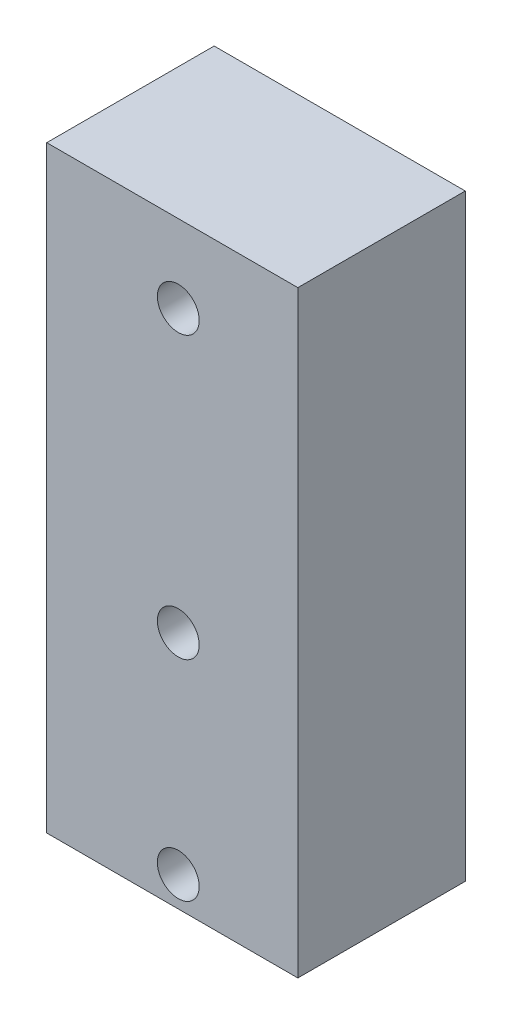
ISO-10303-21;
HEADER;
FILE_DESCRIPTION(('STEP AP214'),'2;1');
FILE_NAME('part.step','',(''),(''),'','','');
FILE_SCHEMA(('AUTOMOTIVE_DESIGN { 1 0 10303 214 1 1 1 1 }'));
ENDSEC;
DATA;
#1=APPLICATION_CONTEXT('core data for automotive mechanical design processes');
#2=APPLICATION_PROTOCOL_DEFINITION('international standard','automotive_design',2000,#1);
#3=PRODUCT_CONTEXT('',#1,'mechanical');
#4=PRODUCT('Part','Part','',(#3));
#5=PRODUCT_RELATED_PRODUCT_CATEGORY('part','',(#4));
#6=PRODUCT_DEFINITION_FORMATION('','',#4);
#7=PRODUCT_DEFINITION_CONTEXT('part definition',#1,'design');
#8=PRODUCT_DEFINITION('design','',#6,#7);
#9=PRODUCT_DEFINITION_SHAPE('','',#8);
#10=(LENGTH_UNIT() NAMED_UNIT(*) SI_UNIT(.MILLI.,.METRE.));
#11=(NAMED_UNIT(*) PLANE_ANGLE_UNIT() SI_UNIT($,.RADIAN.));
#12=(NAMED_UNIT(*) SI_UNIT($,.STERADIAN.) SOLID_ANGLE_UNIT());
#13=UNCERTAINTY_MEASURE_WITH_UNIT(LENGTH_MEASURE(1.E-05),#10,'distance_accuracy_value','');
#14=(GEOMETRIC_REPRESENTATION_CONTEXT(3) GLOBAL_UNCERTAINTY_ASSIGNED_CONTEXT((#13)) GLOBAL_UNIT_ASSIGNED_CONTEXT((#10,
#11,#12)) REPRESENTATION_CONTEXT('',''));
#15=CARTESIAN_POINT('',(0.,0.,0.));
#16=DIRECTION('',(0.,0.,1.));
#17=DIRECTION('',(1.,0.,0.));
#18=AXIS2_PLACEMENT_3D('',#15,#16,#17);
#19=CARTESIAN_POINT('',(10.,50.,2.95454545454545));
#20=DIRECTION('',(-1.,0.,0.));
#21=DIRECTION('',(0.,0.,1.));
#22=AXIS2_PLACEMENT_3D('',#19,#20,#21);
#23=PLANE('',#22);
#24=DIRECTION('',(0.,0.,-1.));
#25=VECTOR('',#24,1.);
#26=CARTESIAN_POINT('',(10.,0.,2.95454545454545));
#27=LINE('',#26,#25);
#28=CARTESIAN_POINT('',(10.,0.,2.95454545454545));
#29=VERTEX_POINT('',#28);
#30=CARTESIAN_POINT('',(10.,0.,-11.0454545454545));
#31=VERTEX_POINT('',#30);
#32=EDGE_CURVE('E98',#29,#31,#27,.T.);
#33=ORIENTED_EDGE('',*,*,#32,.T.);
#34=DIRECTION('',(0.,-1.,0.));
#35=VECTOR('',#34,1.);
#36=CARTESIAN_POINT('',(10.,50.,-11.0454545454545));
#37=LINE('',#36,#35);
#38=CARTESIAN_POINT('',(10.,50.,-11.0454545454545));
#39=VERTEX_POINT('',#38);
#40=EDGE_CURVE('E11',#39,#31,#37,.T.);
#41=ORIENTED_EDGE('',*,*,#40,.F.);
#42=DIRECTION('',(0.,0.,-1.));
#43=VECTOR('',#42,1.);
#44=CARTESIAN_POINT('',(10.,50.,2.95454545454545));
#45=LINE('',#44,#43);
#46=CARTESIAN_POINT('',(10.,50.,2.95454545454545));
#47=VERTEX_POINT('',#46);
#48=EDGE_CURVE('E85',#47,#39,#45,.T.);
#49=ORIENTED_EDGE('',*,*,#48,.F.);
#50=DIRECTION('',(0.,-1.,0.));
#51=VECTOR('',#50,1.);
#52=CARTESIAN_POINT('',(10.,50.,2.95454545454545));
#53=LINE('',#52,#51);
#54=EDGE_CURVE('E94',#47,#29,#53,.T.);
#55=ORIENTED_EDGE('',*,*,#54,.T.);
#56=EDGE_LOOP('',(#33,#41,#49,#55));
#57=FACE_BOUND('',#56,.T.);
#58=ADVANCED_FACE('F33',(#57),#23,.F.);
#59=CARTESIAN_POINT('',(-11.,50.,-11.0454545454545));
#60=DIRECTION('',(0.,0.,1.));
#61=DIRECTION('',(1.,0.,0.));
#62=AXIS2_PLACEMENT_3D('',#59,#60,#61);
#63=PLANE('',#62);
#64=CARTESIAN_POINT('',(0.,43.5,-11.0454545454545));
#65=DIRECTION('',(0.,0.,-1.));
#66=DIRECTION('',(-1.,0.,0.));
#67=AXIS2_PLACEMENT_3D('',#64,#65,#66);
#68=CIRCLE('',#67,1.75);
#69=CARTESIAN_POINT('',(-1.75,43.5,-11.0454545454545));
#70=VERTEX_POINT('',#69);
#71=EDGE_CURVE('E123',#70,#70,#68,.T.);
#72=ORIENTED_EDGE('',*,*,#71,.F.);
#73=EDGE_LOOP('',(#72));
#74=FACE_BOUND('',#73,.T.);
#75=CARTESIAN_POINT('',(0.,20.,-11.0454545454546));
#76=DIRECTION('',(0.,0.,1.));
#77=DIRECTION('',(1.,0.,0.));
#78=AXIS2_PLACEMENT_3D('',#75,#76,#77);
#79=CIRCLE('',#78,1.75);
#80=CARTESIAN_POINT('',(1.75,20.,-11.0454545454546));
#81=VERTEX_POINT('',#80);
#82=EDGE_CURVE('E101',#81,#81,#79,.T.);
#83=ORIENTED_EDGE('',*,*,#82,.T.);
#84=EDGE_LOOP('',(#83));
#85=FACE_BOUND('',#84,.T.);
#86=CARTESIAN_POINT('',(0.,2.5,-11.0454545454546));
#87=DIRECTION('',(0.,0.,1.));
#88=DIRECTION('',(1.,0.,0.));
#89=AXIS2_PLACEMENT_3D('',#86,#87,#88);
#90=CIRCLE('',#89,1.75);
#91=CARTESIAN_POINT('',(1.75,2.5,-11.0454545454546));
#92=VERTEX_POINT('',#91);
#93=EDGE_CURVE('E114',#92,#92,#90,.T.);
#94=ORIENTED_EDGE('',*,*,#93,.T.);
#95=EDGE_LOOP('',(#94));
#96=FACE_BOUND('',#95,.T.);
#97=DIRECTION('',(-1.,0.,0.));
#98=VECTOR('',#97,1.);
#99=CARTESIAN_POINT('',(-11.,0.,-11.0454545454545));
#100=LINE('',#99,#98);
#101=CARTESIAN_POINT('',(-11.,0.,-11.0454545454545));
#102=VERTEX_POINT('',#101);
#103=EDGE_CURVE('E89',#31,#102,#100,.T.);
#104=ORIENTED_EDGE('',*,*,#103,.T.);
#105=DIRECTION('',(0.,-1.,0.));
#106=VECTOR('',#105,1.);
#107=CARTESIAN_POINT('',(-11.,50.,-11.0454545454545));
#108=LINE('',#107,#106);
#109=CARTESIAN_POINT('',(-11.,50.,-11.0454545454545));
#110=VERTEX_POINT('',#109);
#111=EDGE_CURVE('E42',#110,#102,#108,.T.);
#112=ORIENTED_EDGE('',*,*,#111,.F.);
#113=DIRECTION('',(-1.,0.,0.));
#114=VECTOR('',#113,1.);
#115=CARTESIAN_POINT('',(-11.,50.,-11.0454545454545));
#116=LINE('',#115,#114);
#117=EDGE_CURVE('E80',#39,#110,#116,.T.);
#118=ORIENTED_EDGE('',*,*,#117,.F.);
#119=ORIENTED_EDGE('',*,*,#40,.T.);
#120=EDGE_LOOP('',(#104,#112,#118,#119));
#121=FACE_BOUND('',#120,.T.);
#122=ADVANCED_FACE('F88',(#74,#85,#96,#121),#63,.F.);
#123=CARTESIAN_POINT('',(-11.,50.,-11.0454545454545));
#124=DIRECTION('',(1.,0.,0.));
#125=DIRECTION('',(0.,0.,-1.));
#126=AXIS2_PLACEMENT_3D('',#123,#124,#125);
#127=PLANE('',#126);
#128=DIRECTION('',(0.,0.,1.));
#129=VECTOR('',#128,1.);
#130=CARTESIAN_POINT('',(-11.,0.,-11.0454545454545));
#131=LINE('',#130,#129);
#132=CARTESIAN_POINT('',(-11.,0.,2.95454545454546));
#133=VERTEX_POINT('',#132);
#134=EDGE_CURVE('E67',#102,#133,#131,.T.);
#135=ORIENTED_EDGE('',*,*,#134,.T.);
#136=DIRECTION('',(0.,-1.,0.));
#137=VECTOR('',#136,1.);
#138=CARTESIAN_POINT('',(-11.,50.,2.95454545454546));
#139=LINE('',#138,#137);
#140=CARTESIAN_POINT('',(-11.,50.,2.95454545454546));
#141=VERTEX_POINT('',#140);
#142=EDGE_CURVE('E90',#141,#133,#139,.T.);
#143=ORIENTED_EDGE('',*,*,#142,.F.);
#144=DIRECTION('',(0.,0.,1.));
#145=VECTOR('',#144,1.);
#146=CARTESIAN_POINT('',(-11.,50.,-11.0454545454545));
#147=LINE('',#146,#145);
#148=EDGE_CURVE('E83',#110,#141,#147,.T.);
#149=ORIENTED_EDGE('',*,*,#148,.F.);
#150=ORIENTED_EDGE('',*,*,#111,.T.);
#151=EDGE_LOOP('',(#135,#143,#149,#150));
#152=FACE_BOUND('',#151,.T.);
#153=ADVANCED_FACE('F92',(#152),#127,.F.);
#154=CARTESIAN_POINT('',(-11.,50.,2.95454545454546));
#155=DIRECTION('',(0.,0.,-1.));
#156=DIRECTION('',(-1.,0.,0.));
#157=AXIS2_PLACEMENT_3D('',#154,#155,#156);
#158=PLANE('',#157);
#159=CARTESIAN_POINT('',(0.,43.5,2.95454545454546));
#160=DIRECTION('',(0.,0.,-1.));
#161=DIRECTION('',(-1.,0.,0.));
#162=AXIS2_PLACEMENT_3D('',#159,#160,#161);
#163=CIRCLE('',#162,1.75);
#164=CARTESIAN_POINT('',(-1.75,43.5,2.95454545454546));
#165=VERTEX_POINT('',#164);
#166=EDGE_CURVE('E36',#165,#165,#163,.T.);
#167=ORIENTED_EDGE('',*,*,#166,.T.);
#168=EDGE_LOOP('',(#167));
#169=FACE_BOUND('',#168,.T.);
#170=CARTESIAN_POINT('',(0.,20.,2.95454545454546));
#171=DIRECTION('',(0.,0.,1.));
#172=DIRECTION('',(1.,0.,0.));
#173=AXIS2_PLACEMENT_3D('',#170,#171,#172);
#174=CIRCLE('',#173,1.75);
#175=CARTESIAN_POINT('',(1.75,20.,2.95454545454546));
#176=VERTEX_POINT('',#175);
#177=EDGE_CURVE('E117',#176,#176,#174,.T.);
#178=ORIENTED_EDGE('',*,*,#177,.F.);
#179=EDGE_LOOP('',(#178));
#180=FACE_BOUND('',#179,.T.);
#181=CARTESIAN_POINT('',(0.,2.5,2.95454545454546));
#182=DIRECTION('',(0.,0.,1.));
#183=DIRECTION('',(1.,0.,0.));
#184=AXIS2_PLACEMENT_3D('',#181,#182,#183);
#185=CIRCLE('',#184,1.75);
#186=CARTESIAN_POINT('',(1.75,2.5,2.95454545454546));
#187=VERTEX_POINT('',#186);
#188=EDGE_CURVE('E118',#187,#187,#185,.T.);
#189=ORIENTED_EDGE('',*,*,#188,.F.);
#190=EDGE_LOOP('',(#189));
#191=FACE_BOUND('',#190,.T.);
#192=DIRECTION('',(1.,0.,0.));
#193=VECTOR('',#192,1.);
#194=CARTESIAN_POINT('',(-11.,0.,2.95454545454546));
#195=LINE('',#194,#193);
#196=EDGE_CURVE('E73',#133,#29,#195,.T.);
#197=ORIENTED_EDGE('',*,*,#196,.T.);
#198=ORIENTED_EDGE('',*,*,#54,.F.);
#199=DIRECTION('',(1.,0.,0.));
#200=VECTOR('',#199,1.);
#201=CARTESIAN_POINT('',(-11.,50.,2.95454545454546));
#202=LINE('',#201,#200);
#203=EDGE_CURVE('E50',#141,#47,#202,.T.);
#204=ORIENTED_EDGE('',*,*,#203,.F.);
#205=ORIENTED_EDGE('',*,*,#142,.T.);
#206=EDGE_LOOP('',(#197,#198,#204,#205));
#207=FACE_BOUND('',#206,.T.);
#208=ADVANCED_FACE('F106',(#169,#180,#191,#207),#158,.F.);
#209=CARTESIAN_POINT('',(0.,50.,0.));
#210=DIRECTION('',(0.,-1.,0.));
#211=DIRECTION('',(0.,0.,-1.));
#212=AXIS2_PLACEMENT_3D('',#209,#210,#211);
#213=PLANE('',#212);
#214=ORIENTED_EDGE('',*,*,#48,.T.);
#215=ORIENTED_EDGE('',*,*,#117,.T.);
#216=ORIENTED_EDGE('',*,*,#148,.T.);
#217=ORIENTED_EDGE('',*,*,#203,.T.);
#218=EDGE_LOOP('',(#214,#215,#216,#217));
#219=FACE_BOUND('',#218,.T.);
#220=ADVANCED_FACE('F81',(#219),#213,.F.);
#221=CARTESIAN_POINT('',(0.,0.,0.));
#222=DIRECTION('',(0.,-1.,0.));
#223=DIRECTION('',(0.,0.,-1.));
#224=AXIS2_PLACEMENT_3D('',#221,#222,#223);
#225=PLANE('',#224);
#226=ORIENTED_EDGE('',*,*,#32,.F.);
#227=ORIENTED_EDGE('',*,*,#196,.F.);
#228=ORIENTED_EDGE('',*,*,#134,.F.);
#229=ORIENTED_EDGE('',*,*,#103,.F.);
#230=EDGE_LOOP('',(#226,#227,#228,#229));
#231=FACE_BOUND('',#230,.T.);
#232=ADVANCED_FACE('F109',(#231),#225,.T.);
#233=CARTESIAN_POINT('',(0.,2.5,-97.0454545454545));
#234=DIRECTION('',(0.,0.,1.));
#235=DIRECTION('',(1.,0.,0.));
#236=AXIS2_PLACEMENT_3D('',#233,#234,#235);
#237=CYLINDRICAL_SURFACE('',#236,1.75);
#238=ORIENTED_EDGE('',*,*,#188,.T.);
#239=EDGE_LOOP('',(#238));
#240=FACE_BOUND('',#239,.T.);
#241=ORIENTED_EDGE('',*,*,#93,.F.);
#242=EDGE_LOOP('',(#241));
#243=FACE_BOUND('',#242,.T.);
#244=ADVANCED_FACE('F139',(#240,#243),#237,.F.);
#245=CARTESIAN_POINT('',(0.,20.,-97.0454545454545));
#246=DIRECTION('',(0.,0.,1.));
#247=DIRECTION('',(1.,0.,0.));
#248=AXIS2_PLACEMENT_3D('',#245,#246,#247);
#249=CYLINDRICAL_SURFACE('',#248,1.75);
#250=ORIENTED_EDGE('',*,*,#177,.T.);
#251=EDGE_LOOP('',(#250));
#252=FACE_BOUND('',#251,.T.);
#253=ORIENTED_EDGE('',*,*,#82,.F.);
#254=EDGE_LOOP('',(#253));
#255=FACE_BOUND('',#254,.T.);
#256=ADVANCED_FACE('F134',(#252,#255),#249,.F.);
#257=CARTESIAN_POINT('',(0.,43.5,10.9545454545455));
#258=DIRECTION('',(0.,0.,-1.));
#259=DIRECTION('',(-1.,0.,0.));
#260=AXIS2_PLACEMENT_3D('',#257,#258,#259);
#261=CYLINDRICAL_SURFACE('',#260,1.75);
#262=ORIENTED_EDGE('',*,*,#71,.T.);
#263=EDGE_LOOP('',(#262));
#264=FACE_BOUND('',#263,.T.);
#265=ORIENTED_EDGE('',*,*,#166,.F.);
#266=EDGE_LOOP('',(#265));
#267=FACE_BOUND('',#266,.T.);
#268=ADVANCED_FACE('F132',(#264,#267),#261,.F.);
#269=CLOSED_SHELL('',(#58,#122,#153,#208,#220,#232,#244,#256,#268));
#270=MANIFOLD_SOLID_BREP('B2',#269);
#271=ADVANCED_BREP_SHAPE_REPRESENTATION('',(#18,#270),#14);
#272=SHAPE_DEFINITION_REPRESENTATION(#9,#271);
ENDSEC;
END-ISO-10303-21;
